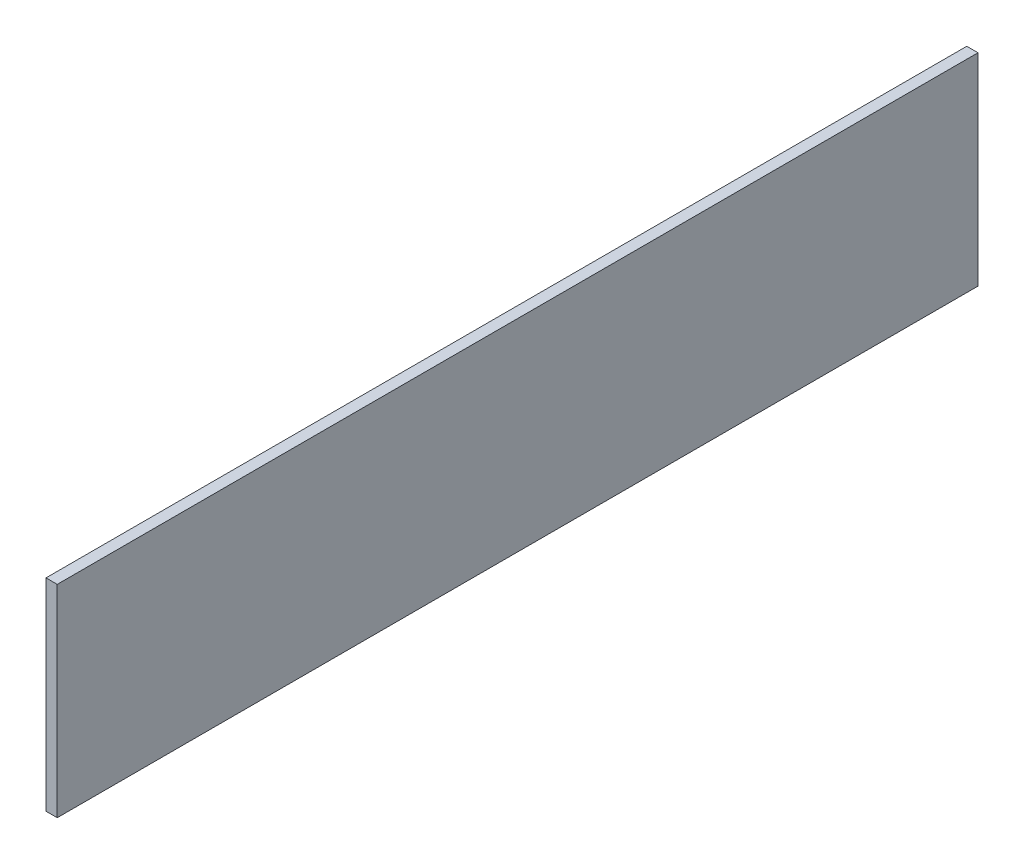
ISO-10303-21;
HEADER;
FILE_DESCRIPTION(('STEP AP214'),'2;1');
FILE_NAME('part.step','',(''),(''),'','','');
FILE_SCHEMA(('AUTOMOTIVE_DESIGN { 1 0 10303 214 1 1 1 1 }'));
ENDSEC;
DATA;
#1=APPLICATION_CONTEXT('core data for automotive mechanical design processes');
#2=APPLICATION_PROTOCOL_DEFINITION('international standard','automotive_design',2000,#1);
#3=PRODUCT_CONTEXT('',#1,'mechanical');
#4=PRODUCT('Part','Part','',(#3));
#5=PRODUCT_RELATED_PRODUCT_CATEGORY('part','',(#4));
#6=PRODUCT_DEFINITION_FORMATION('','',#4);
#7=PRODUCT_DEFINITION_CONTEXT('part definition',#1,'design');
#8=PRODUCT_DEFINITION('design','',#6,#7);
#9=PRODUCT_DEFINITION_SHAPE('','',#8);
#10=(LENGTH_UNIT() NAMED_UNIT(*) SI_UNIT(.MILLI.,.METRE.));
#11=(NAMED_UNIT(*) PLANE_ANGLE_UNIT() SI_UNIT($,.RADIAN.));
#12=(NAMED_UNIT(*) SI_UNIT($,.STERADIAN.) SOLID_ANGLE_UNIT());
#13=UNCERTAINTY_MEASURE_WITH_UNIT(LENGTH_MEASURE(1.E-05),#10,'distance_accuracy_value','');
#14=(GEOMETRIC_REPRESENTATION_CONTEXT(3) GLOBAL_UNCERTAINTY_ASSIGNED_CONTEXT((#13)) GLOBAL_UNIT_ASSIGNED_CONTEXT((#10,
#11,#12)) REPRESENTATION_CONTEXT('',''));
#15=CARTESIAN_POINT('',(0.,0.,0.));
#16=DIRECTION('',(0.,0.,1.));
#17=DIRECTION('',(1.,0.,0.));
#18=AXIS2_PLACEMENT_3D('',#15,#16,#17);
#19=CARTESIAN_POINT('',(3.175,0.,130.175));
#20=DIRECTION('',(0.,0.,-1.));
#21=DIRECTION('',(-1.,0.,0.));
#22=AXIS2_PLACEMENT_3D('',#19,#20,#21);
#23=PLANE('',#22);
#24=DIRECTION('',(0.,-1.,0.));
#25=VECTOR('',#24,1.);
#26=CARTESIAN_POINT('',(0.,0.,130.175));
#27=LINE('',#26,#25);
#28=CARTESIAN_POINT('',(0.,57.15,130.175));
#29=VERTEX_POINT('',#28);
#30=CARTESIAN_POINT('',(0.,0.,130.175));
#31=VERTEX_POINT('',#30);
#32=EDGE_CURVE('E96',#29,#31,#27,.T.);
#33=ORIENTED_EDGE('',*,*,#32,.T.);
#34=DIRECTION('',(-1.,0.,0.));
#35=VECTOR('',#34,1.);
#36=CARTESIAN_POINT('',(3.175,0.,130.175));
#37=LINE('',#36,#35);
#38=CARTESIAN_POINT('',(3.175,0.,130.175));
#39=VERTEX_POINT('',#38);
#40=EDGE_CURVE('E11',#39,#31,#37,.T.);
#41=ORIENTED_EDGE('',*,*,#40,.F.);
#42=DIRECTION('',(0.,-1.,0.));
#43=VECTOR('',#42,1.);
#44=CARTESIAN_POINT('',(3.175,0.,130.175));
#45=LINE('',#44,#43);
#46=CARTESIAN_POINT('',(3.175,57.15,130.175));
#47=VERTEX_POINT('',#46);
#48=EDGE_CURVE('E84',#47,#39,#45,.T.);
#49=ORIENTED_EDGE('',*,*,#48,.F.);
#50=DIRECTION('',(-1.,0.,0.));
#51=VECTOR('',#50,1.);
#52=CARTESIAN_POINT('',(3.175,57.15,130.175));
#53=LINE('',#52,#51);
#54=EDGE_CURVE('E92',#47,#29,#53,.T.);
#55=ORIENTED_EDGE('',*,*,#54,.T.);
#56=EDGE_LOOP('',(#33,#41,#49,#55));
#57=FACE_BOUND('',#56,.T.);
#58=ADVANCED_FACE('F33',(#57),#23,.F.);
#59=CARTESIAN_POINT('',(3.175,0.,130.175));
#60=DIRECTION('',(0.,1.,0.));
#61=DIRECTION('',(0.,0.,1.));
#62=AXIS2_PLACEMENT_3D('',#59,#60,#61);
#63=PLANE('',#62);
#64=DIRECTION('',(0.,0.,-1.));
#65=VECTOR('',#64,1.);
#66=CARTESIAN_POINT('',(0.,0.,130.175));
#67=LINE('',#66,#65);
#68=CARTESIAN_POINT('',(0.,0.,-130.175));
#69=VERTEX_POINT('',#68);
#70=EDGE_CURVE('E88',#31,#69,#67,.T.);
#71=ORIENTED_EDGE('',*,*,#70,.T.);
#72=DIRECTION('',(-1.,0.,0.));
#73=VECTOR('',#72,1.);
#74=CARTESIAN_POINT('',(3.175,0.,-130.175));
#75=LINE('',#74,#73);
#76=CARTESIAN_POINT('',(3.175,0.,-130.175));
#77=VERTEX_POINT('',#76);
#78=EDGE_CURVE('E41',#77,#69,#75,.T.);
#79=ORIENTED_EDGE('',*,*,#78,.F.);
#80=DIRECTION('',(0.,0.,-1.));
#81=VECTOR('',#80,1.);
#82=CARTESIAN_POINT('',(3.175,0.,130.175));
#83=LINE('',#82,#81);
#84=EDGE_CURVE('E79',#39,#77,#83,.T.);
#85=ORIENTED_EDGE('',*,*,#84,.F.);
#86=ORIENTED_EDGE('',*,*,#40,.T.);
#87=EDGE_LOOP('',(#71,#79,#85,#86));
#88=FACE_BOUND('',#87,.T.);
#89=ADVANCED_FACE('F87',(#88),#63,.F.);
#90=CARTESIAN_POINT('',(3.175,0.,-130.175));
#91=DIRECTION('',(0.,0.,1.));
#92=DIRECTION('',(1.,0.,0.));
#93=AXIS2_PLACEMENT_3D('',#90,#91,#92);
#94=PLANE('',#93);
#95=DIRECTION('',(0.,1.,0.));
#96=VECTOR('',#95,1.);
#97=CARTESIAN_POINT('',(0.,0.,-130.175));
#98=LINE('',#97,#96);
#99=CARTESIAN_POINT('',(0.,57.15,-130.175));
#100=VERTEX_POINT('',#99);
#101=EDGE_CURVE('E66',#69,#100,#98,.T.);
#102=ORIENTED_EDGE('',*,*,#101,.T.);
#103=DIRECTION('',(-1.,0.,0.));
#104=VECTOR('',#103,1.);
#105=CARTESIAN_POINT('',(3.175,57.15,-130.175));
#106=LINE('',#105,#104);
#107=CARTESIAN_POINT('',(3.175,57.15,-130.175));
#108=VERTEX_POINT('',#107);
#109=EDGE_CURVE('E89',#108,#100,#106,.T.);
#110=ORIENTED_EDGE('',*,*,#109,.F.);
#111=DIRECTION('',(0.,1.,0.));
#112=VECTOR('',#111,1.);
#113=CARTESIAN_POINT('',(3.175,0.,-130.175));
#114=LINE('',#113,#112);
#115=EDGE_CURVE('E82',#77,#108,#114,.T.);
#116=ORIENTED_EDGE('',*,*,#115,.F.);
#117=ORIENTED_EDGE('',*,*,#78,.T.);
#118=EDGE_LOOP('',(#102,#110,#116,#117));
#119=FACE_BOUND('',#118,.T.);
#120=ADVANCED_FACE('F90',(#119),#94,.F.);
#121=CARTESIAN_POINT('',(3.175,57.15,130.175));
#122=DIRECTION('',(0.,-1.,0.));
#123=DIRECTION('',(0.,0.,-1.));
#124=AXIS2_PLACEMENT_3D('',#121,#122,#123);
#125=PLANE('',#124);
#126=DIRECTION('',(0.,0.,1.));
#127=VECTOR('',#126,1.);
#128=CARTESIAN_POINT('',(0.,57.15,130.175));
#129=LINE('',#128,#127);
#130=EDGE_CURVE('E72',#100,#29,#129,.T.);
#131=ORIENTED_EDGE('',*,*,#130,.T.);
#132=ORIENTED_EDGE('',*,*,#54,.F.);
#133=DIRECTION('',(0.,0.,1.));
#134=VECTOR('',#133,1.);
#135=CARTESIAN_POINT('',(3.175,57.15,130.175));
#136=LINE('',#135,#134);
#137=EDGE_CURVE('E49',#108,#47,#136,.T.);
#138=ORIENTED_EDGE('',*,*,#137,.F.);
#139=ORIENTED_EDGE('',*,*,#109,.T.);
#140=EDGE_LOOP('',(#131,#132,#138,#139));
#141=FACE_BOUND('',#140,.T.);
#142=ADVANCED_FACE('F103',(#141),#125,.F.);
#143=CARTESIAN_POINT('',(3.175,0.,0.));
#144=DIRECTION('',(-1.,0.,0.));
#145=DIRECTION('',(0.,0.,1.));
#146=AXIS2_PLACEMENT_3D('',#143,#144,#145);
#147=PLANE('',#146);
#148=ORIENTED_EDGE('',*,*,#48,.T.);
#149=ORIENTED_EDGE('',*,*,#84,.T.);
#150=ORIENTED_EDGE('',*,*,#115,.T.);
#151=ORIENTED_EDGE('',*,*,#137,.T.);
#152=EDGE_LOOP('',(#148,#149,#150,#151));
#153=FACE_BOUND('',#152,.T.);
#154=ADVANCED_FACE('F80',(#153),#147,.F.);
#155=CARTESIAN_POINT('',(0.,0.,0.));
#156=DIRECTION('',(-1.,0.,0.));
#157=DIRECTION('',(0.,0.,1.));
#158=AXIS2_PLACEMENT_3D('',#155,#156,#157);
#159=PLANE('',#158);
#160=ORIENTED_EDGE('',*,*,#32,.F.);
#161=ORIENTED_EDGE('',*,*,#130,.F.);
#162=ORIENTED_EDGE('',*,*,#101,.F.);
#163=ORIENTED_EDGE('',*,*,#70,.F.);
#164=EDGE_LOOP('',(#160,#161,#162,#163));
#165=FACE_BOUND('',#164,.T.);
#166=ADVANCED_FACE('F106',(#165),#159,.T.);
#167=CLOSED_SHELL('',(#58,#89,#120,#142,#154,#166));
#168=MANIFOLD_SOLID_BREP('B2',#167);
#169=ADVANCED_BREP_SHAPE_REPRESENTATION('',(#18,#168),#14);
#170=SHAPE_DEFINITION_REPRESENTATION(#9,#169);
ENDSEC;
END-ISO-10303-21;
